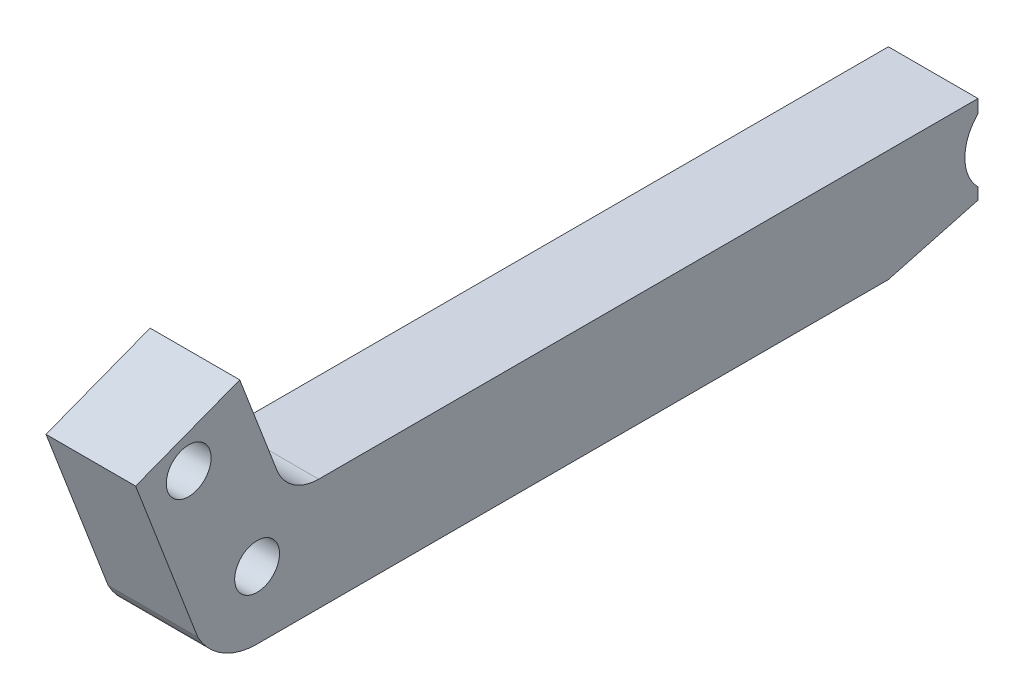
ISO-10303-21;
HEADER;
FILE_DESCRIPTION(('STEP AP214'),'2;1');
FILE_NAME('part.step','',(''),(''),'','','');
FILE_SCHEMA(('AUTOMOTIVE_DESIGN { 1 0 10303 214 1 1 1 1 }'));
ENDSEC;
DATA;
#1=APPLICATION_CONTEXT('core data for automotive mechanical design processes');
#2=APPLICATION_PROTOCOL_DEFINITION('international standard','automotive_design',2000,#1);
#3=PRODUCT_CONTEXT('',#1,'mechanical');
#4=PRODUCT('Part','Part','',(#3));
#5=PRODUCT_RELATED_PRODUCT_CATEGORY('part','',(#4));
#6=PRODUCT_DEFINITION_FORMATION('','',#4);
#7=PRODUCT_DEFINITION_CONTEXT('part definition',#1,'design');
#8=PRODUCT_DEFINITION('design','',#6,#7);
#9=PRODUCT_DEFINITION_SHAPE('','',#8);
#10=(LENGTH_UNIT() NAMED_UNIT(*) SI_UNIT(.MILLI.,.METRE.));
#11=(NAMED_UNIT(*) PLANE_ANGLE_UNIT() SI_UNIT($,.RADIAN.));
#12=(NAMED_UNIT(*) SI_UNIT($,.STERADIAN.) SOLID_ANGLE_UNIT());
#13=UNCERTAINTY_MEASURE_WITH_UNIT(LENGTH_MEASURE(1.E-05),#10,'distance_accuracy_value','');
#14=(GEOMETRIC_REPRESENTATION_CONTEXT(3) GLOBAL_UNCERTAINTY_ASSIGNED_CONTEXT((#13)) GLOBAL_UNIT_ASSIGNED_CONTEXT((#10,
#11,#12)) REPRESENTATION_CONTEXT('',''));
#15=CARTESIAN_POINT('',(0.,0.,0.));
#16=DIRECTION('',(0.,0.,1.));
#17=DIRECTION('',(1.,0.,0.));
#18=AXIS2_PLACEMENT_3D('',#15,#16,#17);
#19=CARTESIAN_POINT('',(10.,0.,0.));
#20=DIRECTION('',(1.,0.,0.));
#21=DIRECTION('',(0.,0.,-1.));
#22=AXIS2_PLACEMENT_3D('',#19,#20,#21);
#23=PLANE('',#22);
#24=CARTESIAN_POINT('',(10.,13.0691535664033,7.63265475051117));
#25=DIRECTION('',(1.,0.,0.));
#26=DIRECTION('',(0.,0.,-1.));
#27=AXIS2_PLACEMENT_3D('',#24,#25,#26);
#28=CIRCLE('',#27,2.5);
#29=CARTESIAN_POINT('',(10.,13.0691535664033,5.13265475051117));
#30=VERTEX_POINT('',#29);
#31=EDGE_CURVE('E240',#30,#30,#28,.F.);
#32=ORIENTED_EDGE('',*,*,#31,.T.);
#33=EDGE_LOOP('',(#32));
#34=FACE_BOUND('',#33,.T.);
#35=DIRECTION('',(0.,0.,-1.));
#36=VECTOR('',#35,1.);
#37=CARTESIAN_POINT('',(10.,-7.5,0.));
#38=LINE('',#37,#36);
#39=CARTESIAN_POINT('',(10.,-7.5,0.));
#40=VERTEX_POINT('',#39);
#41=CARTESIAN_POINT('',(10.,-7.5,-70.4364047930079));
#42=VERTEX_POINT('',#41);
#43=EDGE_CURVE('E117',#40,#42,#38,.T.);
#44=ORIENTED_EDGE('',*,*,#43,.T.);
#45=DIRECTION('',(0.,-0.258819045102518,0.965925826289069));
#46=VECTOR('',#45,1.);
#47=CARTESIAN_POINT('',(10.,-24.6066964624435,-6.59334444550942));
#48=LINE('',#47,#46);
#49=CARTESIAN_POINT('',(10.,-4.82050807568877,-80.4364047930081));
#50=VERTEX_POINT('',#49);
#51=EDGE_CURVE('E11',#42,#50,#48,.F.);
#52=ORIENTED_EDGE('',*,*,#51,.T.);
#53=DIRECTION('',(0.,1.,0.));
#54=VECTOR('',#53,1.);
#55=CARTESIAN_POINT('',(10.,-7.5,-80.4364047930081));
#56=LINE('',#55,#54);
#57=CARTESIAN_POINT('',(10.,-3.53553390593275,-80.4364047930081));
#58=VERTEX_POINT('',#57);
#59=EDGE_CURVE('E125',#50,#58,#56,.T.);
#60=ORIENTED_EDGE('',*,*,#59,.T.);
#61=CARTESIAN_POINT('',(10.,0.,-83.9719386989408));
#62=DIRECTION('',(-1.,0.,0.));
#63=DIRECTION('',(0.,0.,-1.));
#64=AXIS2_PLACEMENT_3D('',#61,#62,#63);
#65=CIRCLE('',#64,5.);
#66=CARTESIAN_POINT('',(10.,3.53553390593275,-80.4364047930081));
#67=VERTEX_POINT('',#66);
#68=EDGE_CURVE('E244',#58,#67,#65,.T.);
#69=ORIENTED_EDGE('',*,*,#68,.T.);
#70=DIRECTION('',(0.,1.,0.));
#71=VECTOR('',#70,1.);
#72=CARTESIAN_POINT('',(10.,5.00000000000002,-80.4364047930081));
#73=LINE('',#72,#71);
#74=CARTESIAN_POINT('',(10.,5.00000000000002,-80.4364047930081));
#75=VERTEX_POINT('',#74);
#76=EDGE_CURVE('E203',#67,#75,#73,.T.);
#77=ORIENTED_EDGE('',*,*,#76,.T.);
#78=DIRECTION('',(0.,0.,1.));
#79=VECTOR('',#78,1.);
#80=CARTESIAN_POINT('',(10.,5.00000000000002,-80.4364047930081));
#81=LINE('',#80,#79);
#82=CARTESIAN_POINT('',(10.,5.00000000000001,-6.87280958601613));
#83=VERTEX_POINT('',#82);
#84=EDGE_CURVE('E220',#75,#83,#81,.T.);
#85=ORIENTED_EDGE('',*,*,#84,.T.);
#86=CARTESIAN_POINT('',(10.,10.,-6.87280958601614));
#87=DIRECTION('',(1.,0.,0.));
#88=DIRECTION('',(0.,0.,-1.));
#89=AXIS2_PLACEMENT_3D('',#86,#87,#88);
#90=CIRCLE('',#89,5.);
#91=CARTESIAN_POINT('',(10.,8.20816025227352,-2.20490745353012));
#92=VERTEX_POINT('',#91);
#93=EDGE_CURVE('E154',#83,#92,#90,.F.);
#94=ORIENTED_EDGE('',*,*,#93,.T.);
#95=DIRECTION('',(0.,0.933580426497203,0.358367949545298));
#96=VECTOR('',#95,1.);
#97=CARTESIAN_POINT('',(10.,5.00000000000001,-3.43640479300806));
#98=LINE('',#97,#96);
#99=CARTESIAN_POINT('',(10.,19.003706397458,1.93911445017141));
#100=VERTEX_POINT('',#99);
#101=EDGE_CURVE('E218',#92,#100,#98,.T.);
#102=ORIENTED_EDGE('',*,*,#101,.T.);
#103=DIRECTION('',(0.,-0.358367949545298,0.933580426497203));
#104=VECTOR('',#103,1.);
#105=CARTESIAN_POINT('',(10.,19.003706397458,1.93911445017141));
#106=LINE('',#105,#104);
#107=CARTESIAN_POINT('',(10.,14.544845311417,13.5548447064057));
#108=VERTEX_POINT('',#107);
#109=EDGE_CURVE('E224',#100,#108,#106,.T.);
#110=ORIENTED_EDGE('',*,*,#109,.T.);
#111=DIRECTION('',(0.,-0.933580426497202,-0.358367949545298));
#112=VECTOR('',#111,1.);
#113=CARTESIAN_POINT('',(10.,14.544845311417,13.5548447064057));
#114=LINE('',#113,#112);
#115=CARTESIAN_POINT('',(10.,-3.53514147942628,6.61458802348565));
#116=VERTEX_POINT('',#115);
#117=EDGE_CURVE('E131',#108,#116,#114,.T.);
#118=ORIENTED_EDGE('',*,*,#117,.T.);
#119=CARTESIAN_POINT('',(10.,0.,0.));
#120=DIRECTION('',(1.,0.,0.));
#121=DIRECTION('',(0.,0.,-1.));
#122=AXIS2_PLACEMENT_3D('',#119,#120,#121);
#123=CIRCLE('',#122,7.5);
#124=EDGE_CURVE('E126',#116,#40,#123,.T.);
#125=ORIENTED_EDGE('',*,*,#124,.T.);
#126=EDGE_LOOP('',(#44,#52,#60,#69,#77,#85,#94,#102,#110,#118,#125));
#127=FACE_BOUND('',#126,.T.);
#128=CARTESIAN_POINT('',(10.,0.,0.));
#129=DIRECTION('',(1.,0.,0.));
#130=DIRECTION('',(0.,0.,-1.));
#131=AXIS2_PLACEMENT_3D('',#128,#129,#130);
#132=CIRCLE('',#131,2.5);
#133=CARTESIAN_POINT('',(10.,0.,-2.5));
#134=VERTEX_POINT('',#133);
#135=EDGE_CURVE('E230',#134,#134,#132,.T.);
#136=ORIENTED_EDGE('',*,*,#135,.F.);
#137=EDGE_LOOP('',(#136));
#138=FACE_BOUND('',#137,.T.);
#139=ADVANCED_FACE('F38',(#34,#127,#138),#23,.T.);
#140=CARTESIAN_POINT('',(0.,0.,0.));
#141=DIRECTION('',(1.,0.,0.));
#142=DIRECTION('',(0.,0.,-1.));
#143=AXIS2_PLACEMENT_3D('',#140,#141,#142);
#144=PLANE('',#143);
#145=CARTESIAN_POINT('',(0.,13.0691535664033,7.63265475051117));
#146=DIRECTION('',(-1.,0.,0.));
#147=DIRECTION('',(0.,0.,1.));
#148=AXIS2_PLACEMENT_3D('',#145,#146,#147);
#149=CIRCLE('',#148,2.5);
#150=CARTESIAN_POINT('',(0.,13.0691535664033,10.1326547505112));
#151=VERTEX_POINT('',#150);
#152=EDGE_CURVE('E237',#151,#151,#149,.T.);
#153=ORIENTED_EDGE('',*,*,#152,.F.);
#154=EDGE_LOOP('',(#153));
#155=FACE_BOUND('',#154,.T.);
#156=DIRECTION('',(0.,1.,0.));
#157=VECTOR('',#156,1.);
#158=CARTESIAN_POINT('',(0.,-7.5,-80.4364047930081));
#159=LINE('',#158,#157);
#160=CARTESIAN_POINT('',(0.,-4.82050807568877,-80.4364047930081));
#161=VERTEX_POINT('',#160);
#162=CARTESIAN_POINT('',(0.,-3.53553390593275,-80.4364047930081));
#163=VERTEX_POINT('',#162);
#164=EDGE_CURVE('E164',#161,#163,#159,.T.);
#165=ORIENTED_EDGE('',*,*,#164,.F.);
#166=DIRECTION('',(0.,0.258819045102518,-0.965925826289069));
#167=VECTOR('',#166,1.);
#168=CARTESIAN_POINT('',(0.,-4.82050807568877,-80.4364047930081));
#169=LINE('',#168,#167);
#170=CARTESIAN_POINT('',(0.,-7.5,-70.4364047930079));
#171=VERTEX_POINT('',#170);
#172=EDGE_CURVE('E60',#161,#171,#169,.F.);
#173=ORIENTED_EDGE('',*,*,#172,.T.);
#174=DIRECTION('',(0.,0.,-1.));
#175=VECTOR('',#174,1.);
#176=CARTESIAN_POINT('',(0.,-7.5,0.));
#177=LINE('',#176,#175);
#178=CARTESIAN_POINT('',(0.,-7.5,0.));
#179=VERTEX_POINT('',#178);
#180=EDGE_CURVE('E171',#179,#171,#177,.T.);
#181=ORIENTED_EDGE('',*,*,#180,.F.);
#182=CARTESIAN_POINT('',(0.,0.,0.));
#183=DIRECTION('',(1.,0.,0.));
#184=DIRECTION('',(0.,0.,-1.));
#185=AXIS2_PLACEMENT_3D('',#182,#183,#184);
#186=CIRCLE('',#185,7.5);
#187=CARTESIAN_POINT('',(0.,-3.53514147942628,6.61458802348565));
#188=VERTEX_POINT('',#187);
#189=EDGE_CURVE('E139',#188,#179,#186,.T.);
#190=ORIENTED_EDGE('',*,*,#189,.F.);
#191=DIRECTION('',(0.,-0.933580426497202,-0.358367949545298));
#192=VECTOR('',#191,1.);
#193=CARTESIAN_POINT('',(0.,14.544845311417,13.5548447064057));
#194=LINE('',#193,#192);
#195=CARTESIAN_POINT('',(0.,14.544845311417,13.5548447064057));
#196=VERTEX_POINT('',#195);
#197=EDGE_CURVE('E135',#196,#188,#194,.T.);
#198=ORIENTED_EDGE('',*,*,#197,.F.);
#199=DIRECTION('',(0.,-0.358367949545298,0.933580426497203));
#200=VECTOR('',#199,1.);
#201=CARTESIAN_POINT('',(0.,19.003706397458,1.93911445017141));
#202=LINE('',#201,#200);
#203=CARTESIAN_POINT('',(0.,19.003706397458,1.93911445017141));
#204=VERTEX_POINT('',#203);
#205=EDGE_CURVE('E184',#204,#196,#202,.T.);
#206=ORIENTED_EDGE('',*,*,#205,.F.);
#207=DIRECTION('',(0.,0.933580426497203,0.358367949545298));
#208=VECTOR('',#207,1.);
#209=CARTESIAN_POINT('',(0.,5.00000000000001,-3.43640479300806));
#210=LINE('',#209,#208);
#211=CARTESIAN_POINT('',(0.,8.20816025227352,-2.20490745353012));
#212=VERTEX_POINT('',#211);
#213=EDGE_CURVE('E182',#212,#204,#210,.T.);
#214=ORIENTED_EDGE('',*,*,#213,.F.);
#215=CARTESIAN_POINT('',(0.,10.,-6.87280958601614));
#216=DIRECTION('',(1.,0.,0.));
#217=DIRECTION('',(0.,0.,-1.));
#218=AXIS2_PLACEMENT_3D('',#215,#216,#217);
#219=CIRCLE('',#218,5.);
#220=CARTESIAN_POINT('',(0.,5.00000000000001,-6.87280958601613));
#221=VERTEX_POINT('',#220);
#222=EDGE_CURVE('E152',#212,#221,#219,.T.);
#223=ORIENTED_EDGE('',*,*,#222,.T.);
#224=DIRECTION('',(0.,0.,1.));
#225=VECTOR('',#224,1.);
#226=CARTESIAN_POINT('',(0.,5.00000000000002,-80.4364047930081));
#227=LINE('',#226,#225);
#228=CARTESIAN_POINT('',(0.,5.00000000000002,-80.4364047930081));
#229=VERTEX_POINT('',#228);
#230=EDGE_CURVE('E179',#229,#221,#227,.T.);
#231=ORIENTED_EDGE('',*,*,#230,.F.);
#232=DIRECTION('',(0.,1.,0.));
#233=VECTOR('',#232,1.);
#234=CARTESIAN_POINT('',(0.,5.00000000000002,-80.4364047930081));
#235=LINE('',#234,#233);
#236=CARTESIAN_POINT('',(0.,3.53553390593275,-80.4364047930081));
#237=VERTEX_POINT('',#236);
#238=EDGE_CURVE('E173',#237,#229,#235,.T.);
#239=ORIENTED_EDGE('',*,*,#238,.F.);
#240=CARTESIAN_POINT('',(0.,0.,-83.9719386989408));
#241=DIRECTION('',(-1.,0.,0.));
#242=DIRECTION('',(0.,0.,-1.));
#243=AXIS2_PLACEMENT_3D('',#240,#241,#242);
#244=CIRCLE('',#243,5.);
#245=EDGE_CURVE('E170',#163,#237,#244,.T.);
#246=ORIENTED_EDGE('',*,*,#245,.F.);
#247=EDGE_LOOP('',(#165,#173,#181,#190,#198,#206,#214,#223,#231,#239,#246));
#248=FACE_BOUND('',#247,.T.);
#249=CARTESIAN_POINT('',(0.,0.,0.));
#250=DIRECTION('',(1.,0.,0.));
#251=DIRECTION('',(0.,0.,-1.));
#252=AXIS2_PLACEMENT_3D('',#249,#250,#251);
#253=CIRCLE('',#252,2.5);
#254=CARTESIAN_POINT('',(0.,0.,-2.5));
#255=VERTEX_POINT('',#254);
#256=EDGE_CURVE('E232',#255,#255,#253,.T.);
#257=ORIENTED_EDGE('',*,*,#256,.T.);
#258=EDGE_LOOP('',(#257));
#259=FACE_BOUND('',#258,.T.);
#260=ADVANCED_FACE('F167',(#155,#248,#259),#144,.F.);
#261=CARTESIAN_POINT('',(10.,0.,0.));
#262=DIRECTION('',(-1.,0.,0.));
#263=DIRECTION('',(0.,0.,1.));
#264=AXIS2_PLACEMENT_3D('',#261,#262,#263);
#265=CYLINDRICAL_SURFACE('',#264,7.5);
#266=ORIENTED_EDGE('',*,*,#189,.T.);
#267=DIRECTION('',(-1.,0.,0.));
#268=VECTOR('',#267,1.);
#269=CARTESIAN_POINT('',(10.,-7.5,0.));
#270=LINE('',#269,#268);
#271=EDGE_CURVE('E121',#40,#179,#270,.T.);
#272=ORIENTED_EDGE('',*,*,#271,.F.);
#273=ORIENTED_EDGE('',*,*,#124,.F.);
#274=DIRECTION('',(-1.,0.,0.));
#275=VECTOR('',#274,1.);
#276=CARTESIAN_POINT('',(10.,-3.53514147942628,6.61458802348565));
#277=LINE('',#276,#275);
#278=EDGE_CURVE('E187',#116,#188,#277,.T.);
#279=ORIENTED_EDGE('',*,*,#278,.T.);
#280=EDGE_LOOP('',(#266,#272,#273,#279));
#281=FACE_BOUND('',#280,.T.);
#282=ADVANCED_FACE('F137',(#281),#265,.T.);
#283=CARTESIAN_POINT('',(10.,-7.5,0.));
#284=DIRECTION('',(0.,1.,0.));
#285=DIRECTION('',(0.,0.,1.));
#286=AXIS2_PLACEMENT_3D('',#283,#284,#285);
#287=PLANE('',#286);
#288=ORIENTED_EDGE('',*,*,#180,.T.);
#289=DIRECTION('',(1.,0.,0.));
#290=VECTOR('',#289,1.);
#291=CARTESIAN_POINT('',(10.,-7.5,-70.4364047930079));
#292=LINE('',#291,#290);
#293=EDGE_CURVE('E46',#171,#42,#292,.T.);
#294=ORIENTED_EDGE('',*,*,#293,.T.);
#295=ORIENTED_EDGE('',*,*,#43,.F.);
#296=ORIENTED_EDGE('',*,*,#271,.T.);
#297=EDGE_LOOP('',(#288,#294,#295,#296));
#298=FACE_BOUND('',#297,.T.);
#299=ADVANCED_FACE('F119',(#298),#287,.F.);
#300=CARTESIAN_POINT('',(10.,-7.5,-80.4364047930081));
#301=DIRECTION('',(0.,0.,1.));
#302=DIRECTION('',(1.,0.,0.));
#303=AXIS2_PLACEMENT_3D('',#300,#301,#302);
#304=PLANE('',#303);
#305=ORIENTED_EDGE('',*,*,#59,.F.);
#306=DIRECTION('',(-1.,0.,0.));
#307=VECTOR('',#306,1.);
#308=CARTESIAN_POINT('',(10.,-4.82050807568877,-80.4364047930081));
#309=LINE('',#308,#307);
#310=EDGE_CURVE('E156',#50,#161,#309,.T.);
#311=ORIENTED_EDGE('',*,*,#310,.T.);
#312=ORIENTED_EDGE('',*,*,#164,.T.);
#313=DIRECTION('',(-1.,0.,0.));
#314=VECTOR('',#313,1.);
#315=CARTESIAN_POINT('',(10.,-3.53553390593275,-80.4364047930081));
#316=LINE('',#315,#314);
#317=EDGE_CURVE('E141',#58,#163,#316,.T.);
#318=ORIENTED_EDGE('',*,*,#317,.F.);
#319=EDGE_LOOP('',(#305,#311,#312,#318));
#320=FACE_BOUND('',#319,.T.);
#321=ADVANCED_FACE('F162',(#320),#304,.F.);
#322=CARTESIAN_POINT('',(10.,0.,-83.9719386989408));
#323=DIRECTION('',(-1.,0.,0.));
#324=DIRECTION('',(0.,0.,1.));
#325=AXIS2_PLACEMENT_3D('',#322,#323,#324);
#326=CYLINDRICAL_SURFACE('',#325,5.);
#327=ORIENTED_EDGE('',*,*,#245,.T.);
#328=DIRECTION('',(-1.,0.,0.));
#329=VECTOR('',#328,1.);
#330=CARTESIAN_POINT('',(10.,3.53553390593275,-80.4364047930081));
#331=LINE('',#330,#329);
#332=EDGE_CURVE('E147',#67,#237,#331,.T.);
#333=ORIENTED_EDGE('',*,*,#332,.F.);
#334=ORIENTED_EDGE('',*,*,#68,.F.);
#335=ORIENTED_EDGE('',*,*,#317,.T.);
#336=EDGE_LOOP('',(#327,#333,#334,#335));
#337=FACE_BOUND('',#336,.T.);
#338=ADVANCED_FACE('F245',(#337),#326,.F.);
#339=CARTESIAN_POINT('',(10.,5.00000000000002,-80.4364047930081));
#340=DIRECTION('',(0.,0.,1.));
#341=DIRECTION('',(1.,0.,0.));
#342=AXIS2_PLACEMENT_3D('',#339,#340,#341);
#343=PLANE('',#342);
#344=ORIENTED_EDGE('',*,*,#238,.T.);
#345=DIRECTION('',(-1.,0.,0.));
#346=VECTOR('',#345,1.);
#347=CARTESIAN_POINT('',(10.,5.00000000000002,-80.4364047930081));
#348=LINE('',#347,#346);
#349=EDGE_CURVE('E195',#75,#229,#348,.T.);
#350=ORIENTED_EDGE('',*,*,#349,.F.);
#351=ORIENTED_EDGE('',*,*,#76,.F.);
#352=ORIENTED_EDGE('',*,*,#332,.T.);
#353=EDGE_LOOP('',(#344,#350,#351,#352));
#354=FACE_BOUND('',#353,.T.);
#355=ADVANCED_FACE('F201',(#354),#343,.F.);
#356=CARTESIAN_POINT('',(10.,5.00000000000002,-80.4364047930081));
#357=DIRECTION('',(0.,-1.,0.));
#358=DIRECTION('',(0.,0.,-1.));
#359=AXIS2_PLACEMENT_3D('',#356,#357,#358);
#360=PLANE('',#359);
#361=ORIENTED_EDGE('',*,*,#230,.T.);
#362=DIRECTION('',(-1.,0.,0.));
#363=VECTOR('',#362,1.);
#364=CARTESIAN_POINT('',(10.,5.00000000000001,-6.87280958601614));
#365=LINE('',#364,#363);
#366=EDGE_CURVE('E144',#221,#83,#365,.F.);
#367=ORIENTED_EDGE('',*,*,#366,.T.);
#368=ORIENTED_EDGE('',*,*,#84,.F.);
#369=ORIENTED_EDGE('',*,*,#349,.T.);
#370=EDGE_LOOP('',(#361,#367,#368,#369));
#371=FACE_BOUND('',#370,.T.);
#372=ADVANCED_FACE('F210',(#371),#360,.F.);
#373=CARTESIAN_POINT('',(10.,5.00000000000001,-3.43640479300806));
#374=DIRECTION('',(0.,-0.358367949545298,0.933580426497203));
#375=DIRECTION('',(0.,-0.933580426497203,-0.358367949545298));
#376=AXIS2_PLACEMENT_3D('',#373,#374,#375);
#377=PLANE('',#376);
#378=ORIENTED_EDGE('',*,*,#101,.F.);
#379=DIRECTION('',(-1.,0.,0.));
#380=VECTOR('',#379,1.);
#381=CARTESIAN_POINT('',(0.,8.20816025227352,-2.20490745353012));
#382=LINE('',#381,#380);
#383=EDGE_CURVE('E140',#92,#212,#382,.T.);
#384=ORIENTED_EDGE('',*,*,#383,.T.);
#385=ORIENTED_EDGE('',*,*,#213,.T.);
#386=DIRECTION('',(-1.,0.,0.));
#387=VECTOR('',#386,1.);
#388=CARTESIAN_POINT('',(10.,19.003706397458,1.93911445017141));
#389=LINE('',#388,#387);
#390=EDGE_CURVE('E192',#100,#204,#389,.T.);
#391=ORIENTED_EDGE('',*,*,#390,.F.);
#392=EDGE_LOOP('',(#378,#384,#385,#391));
#393=FACE_BOUND('',#392,.T.);
#394=ADVANCED_FACE('F222',(#393),#377,.F.);
#395=CARTESIAN_POINT('',(10.,19.003706397458,1.93911445017141));
#396=DIRECTION('',(0.,-0.933580426497203,-0.358367949545298));
#397=DIRECTION('',(0.,0.358367949545298,-0.933580426497203));
#398=AXIS2_PLACEMENT_3D('',#395,#396,#397);
#399=PLANE('',#398);
#400=ORIENTED_EDGE('',*,*,#205,.T.);
#401=DIRECTION('',(-1.,0.,0.));
#402=VECTOR('',#401,1.);
#403=CARTESIAN_POINT('',(10.,14.544845311417,13.5548447064057));
#404=LINE('',#403,#402);
#405=EDGE_CURVE('E189',#108,#196,#404,.T.);
#406=ORIENTED_EDGE('',*,*,#405,.F.);
#407=ORIENTED_EDGE('',*,*,#109,.F.);
#408=ORIENTED_EDGE('',*,*,#390,.T.);
#409=EDGE_LOOP('',(#400,#406,#407,#408));
#410=FACE_BOUND('',#409,.T.);
#411=ADVANCED_FACE('F270',(#410),#399,.F.);
#412=CARTESIAN_POINT('',(10.,14.544845311417,13.5548447064057));
#413=DIRECTION('',(0.,0.358367949545298,-0.933580426497203));
#414=DIRECTION('',(0.,0.933580426497203,0.358367949545298));
#415=AXIS2_PLACEMENT_3D('',#412,#413,#414);
#416=PLANE('',#415);
#417=ORIENTED_EDGE('',*,*,#197,.T.);
#418=ORIENTED_EDGE('',*,*,#278,.F.);
#419=ORIENTED_EDGE('',*,*,#117,.F.);
#420=ORIENTED_EDGE('',*,*,#405,.T.);
#421=EDGE_LOOP('',(#417,#418,#419,#420));
#422=FACE_BOUND('',#421,.T.);
#423=ADVANCED_FACE('F267',(#422),#416,.F.);
#424=CARTESIAN_POINT('',(10.,0.,0.));
#425=DIRECTION('',(-1.,0.,0.));
#426=DIRECTION('',(0.,0.,1.));
#427=AXIS2_PLACEMENT_3D('',#424,#425,#426);
#428=CYLINDRICAL_SURFACE('',#427,2.5);
#429=ORIENTED_EDGE('',*,*,#135,.T.);
#430=EDGE_LOOP('',(#429));
#431=FACE_BOUND('',#430,.T.);
#432=ORIENTED_EDGE('',*,*,#256,.F.);
#433=EDGE_LOOP('',(#432));
#434=FACE_BOUND('',#433,.T.);
#435=ADVANCED_FACE('F264',(#431,#434),#428,.F.);
#436=CARTESIAN_POINT('',(10.,10.,-6.87280958601614));
#437=DIRECTION('',(1.,0.,0.));
#438=DIRECTION('',(0.,0.,-1.));
#439=AXIS2_PLACEMENT_3D('',#436,#437,#438);
#440=CYLINDRICAL_SURFACE('',#439,5.);
#441=ORIENTED_EDGE('',*,*,#93,.F.);
#442=ORIENTED_EDGE('',*,*,#366,.F.);
#443=ORIENTED_EDGE('',*,*,#222,.F.);
#444=ORIENTED_EDGE('',*,*,#383,.F.);
#445=EDGE_LOOP('',(#441,#442,#443,#444));
#446=FACE_BOUND('',#445,.T.);
#447=ADVANCED_FACE('F215',(#446),#440,.F.);
#448=CARTESIAN_POINT('',(10.001,13.0691535664033,7.63265475051117));
#449=DIRECTION('',(-1.,0.,0.));
#450=DIRECTION('',(0.,0.,1.));
#451=AXIS2_PLACEMENT_3D('',#448,#449,#450);
#452=CYLINDRICAL_SURFACE('',#451,2.5);
#453=ORIENTED_EDGE('',*,*,#31,.F.);
#454=EDGE_LOOP('',(#453));
#455=FACE_BOUND('',#454,.T.);
#456=ORIENTED_EDGE('',*,*,#152,.T.);
#457=EDGE_LOOP('',(#456));
#458=FACE_BOUND('',#457,.T.);
#459=ADVANCED_FACE('F305',(#455,#458),#452,.F.);
#460=CARTESIAN_POINT('',(10.,-4.82050807568877,-80.4364047930081));
#461=DIRECTION('',(0.,0.965925826289069,0.258819045102518));
#462=DIRECTION('',(-1.,0.,0.));
#463=AXIS2_PLACEMENT_3D('',#460,#461,#462);
#464=PLANE('',#463);
#465=ORIENTED_EDGE('',*,*,#51,.F.);
#466=ORIENTED_EDGE('',*,*,#293,.F.);
#467=ORIENTED_EDGE('',*,*,#172,.F.);
#468=ORIENTED_EDGE('',*,*,#310,.F.);
#469=EDGE_LOOP('',(#465,#466,#467,#468));
#470=FACE_BOUND('',#469,.T.);
#471=ADVANCED_FACE('F40',(#470),#464,.F.);
#472=CLOSED_SHELL('',(#139,#260,#282,#299,#321,#338,#355,#372,#394,#411,#423,#435,#447,#459,#471));
#473=MANIFOLD_SOLID_BREP('B2',#472);
#474=ADVANCED_BREP_SHAPE_REPRESENTATION('',(#18,#473),#14);
#475=SHAPE_DEFINITION_REPRESENTATION(#9,#474);
ENDSEC;
END-ISO-10303-21;
